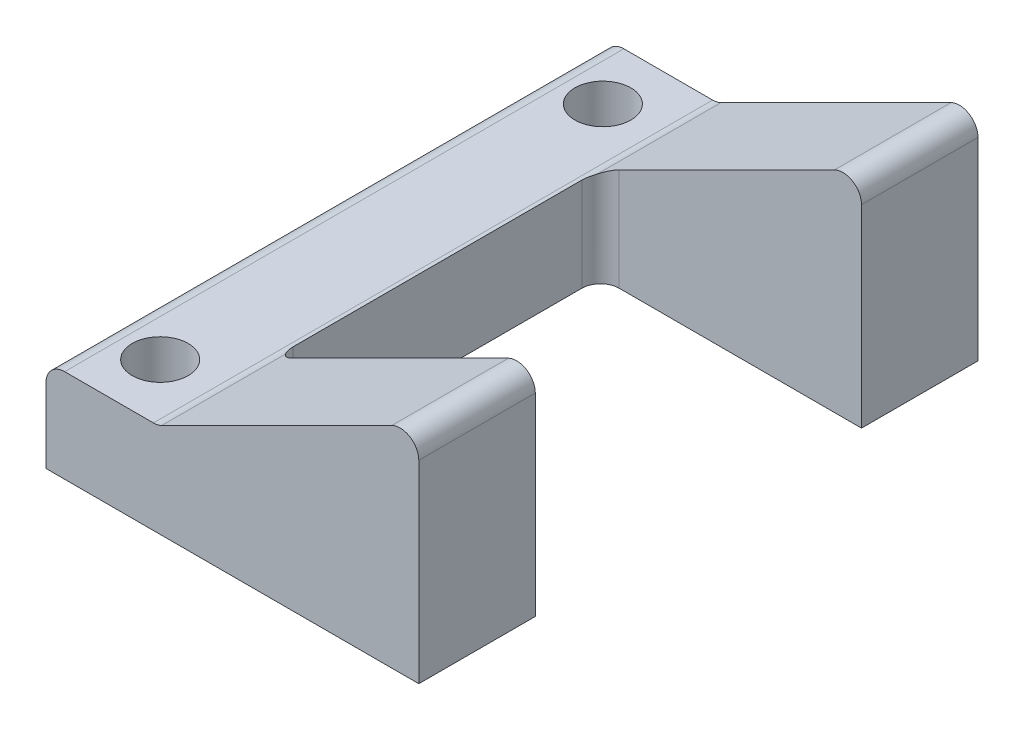
ISO-10303-21;
HEADER;
FILE_DESCRIPTION(('STEP AP214'),'2;1');
FILE_NAME('part.step','',(''),(''),'','','');
FILE_SCHEMA(('AUTOMOTIVE_DESIGN { 1 0 10303 214 1 1 1 1 }'));
ENDSEC;
DATA;
#1=APPLICATION_CONTEXT('core data for automotive mechanical design processes');
#2=APPLICATION_PROTOCOL_DEFINITION('international standard','automotive_design',2000,#1);
#3=PRODUCT_CONTEXT('',#1,'mechanical');
#4=PRODUCT('Part','Part','',(#3));
#5=PRODUCT_RELATED_PRODUCT_CATEGORY('part','',(#4));
#6=PRODUCT_DEFINITION_FORMATION('','',#4);
#7=PRODUCT_DEFINITION_CONTEXT('part definition',#1,'design');
#8=PRODUCT_DEFINITION('design','',#6,#7);
#9=PRODUCT_DEFINITION_SHAPE('','',#8);
#10=(LENGTH_UNIT() NAMED_UNIT(*) SI_UNIT(.MILLI.,.METRE.));
#11=(NAMED_UNIT(*) PLANE_ANGLE_UNIT() SI_UNIT($,.RADIAN.));
#12=(NAMED_UNIT(*) SI_UNIT($,.STERADIAN.) SOLID_ANGLE_UNIT());
#13=UNCERTAINTY_MEASURE_WITH_UNIT(LENGTH_MEASURE(1.E-05),#10,'distance_accuracy_value','');
#14=(GEOMETRIC_REPRESENTATION_CONTEXT(3) GLOBAL_UNCERTAINTY_ASSIGNED_CONTEXT((#13)) GLOBAL_UNIT_ASSIGNED_CONTEXT((#10,
#11,#12)) REPRESENTATION_CONTEXT('',''));
#15=CARTESIAN_POINT('',(0.,0.,0.));
#16=DIRECTION('',(0.,0.,1.));
#17=DIRECTION('',(1.,0.,0.));
#18=AXIS2_PLACEMENT_3D('',#15,#16,#17);
#19=CARTESIAN_POINT('',(20.,10.3819660112501,15.));
#20=DIRECTION('',(-1.,0.,0.));
#21=DIRECTION('',(0.,-1.,0.));
#22=AXIS2_PLACEMENT_3D('',#19,#20,#21);
#23=PLANE('',#22);
#24=DIRECTION('',(0.,0.,-1.));
#25=VECTOR('',#24,1.);
#26=CARTESIAN_POINT('',(20.,0.,15.));
#27=LINE('',#26,#25);
#28=CARTESIAN_POINT('',(20.,0.,15.));
#29=VERTEX_POINT('',#28);
#30=CARTESIAN_POINT('',(20.,0.,8.75));
#31=VERTEX_POINT('',#30);
#32=EDGE_CURVE('E179',#29,#31,#27,.T.);
#33=ORIENTED_EDGE('',*,*,#32,.T.);
#34=DIRECTION('',(0.,-1.,0.));
#35=VECTOR('',#34,1.);
#36=CARTESIAN_POINT('',(20.,30.,8.75));
#37=LINE('',#36,#35);
#38=CARTESIAN_POINT('',(20.,10.3819660112501,8.75));
#39=VERTEX_POINT('',#38);
#40=EDGE_CURVE('E285',#39,#31,#37,.T.);
#41=ORIENTED_EDGE('',*,*,#40,.F.);
#42=DIRECTION('',(0.,0.,-1.));
#43=VECTOR('',#42,1.);
#44=CARTESIAN_POINT('',(20.,10.3819660112501,15.));
#45=LINE('',#44,#43);
#46=CARTESIAN_POINT('',(20.,10.3819660112501,15.));
#47=VERTEX_POINT('',#46);
#48=EDGE_CURVE('E175',#47,#39,#45,.T.);
#49=ORIENTED_EDGE('',*,*,#48,.F.);
#50=DIRECTION('',(0.,1.,0.));
#51=VECTOR('',#50,1.);
#52=CARTESIAN_POINT('',(20.,10.3819660112501,15.));
#53=LINE('',#52,#51);
#54=EDGE_CURVE('E100',#29,#47,#53,.T.);
#55=ORIENTED_EDGE('',*,*,#54,.F.);
#56=EDGE_LOOP('',(#33,#41,#49,#55));
#57=FACE_BOUND('',#56,.T.);
#58=ADVANCED_FACE('F34',(#57),#23,.F.);
#59=CARTESIAN_POINT('',(19.,10.3819660112501,15.));
#60=DIRECTION('',(0.,0.,-1.));
#61=DIRECTION('',(-1.,0.,0.));
#62=AXIS2_PLACEMENT_3D('',#59,#60,#61);
#63=CYLINDRICAL_SURFACE('',#62,0.999999999999999);
#64=ORIENTED_EDGE('',*,*,#48,.T.);
#65=CARTESIAN_POINT('',(19.,10.3819660112501,8.75));
#66=DIRECTION('',(0.,0.,1.));
#67=DIRECTION('',(1.,0.,0.));
#68=AXIS2_PLACEMENT_3D('',#65,#66,#67);
#69=CIRCLE('',#68,0.999999999999999);
#70=CARTESIAN_POINT('',(18.5527864045,11.27639320225,8.75));
#71=VERTEX_POINT('',#70);
#72=EDGE_CURVE('E147',#39,#71,#69,.T.);
#73=ORIENTED_EDGE('',*,*,#72,.T.);
#74=DIRECTION('',(0.,0.,-1.));
#75=VECTOR('',#74,1.);
#76=CARTESIAN_POINT('',(18.5527864045,11.27639320225,15.));
#77=LINE('',#76,#75);
#78=CARTESIAN_POINT('',(18.5527864045,11.27639320225,15.));
#79=VERTEX_POINT('',#78);
#80=EDGE_CURVE('E171',#79,#71,#77,.T.);
#81=ORIENTED_EDGE('',*,*,#80,.F.);
#82=CARTESIAN_POINT('',(19.,10.3819660112501,15.));
#83=DIRECTION('',(0.,0.,1.));
#84=DIRECTION('',(-1.,0.,0.));
#85=AXIS2_PLACEMENT_3D('',#82,#83,#84);
#86=CIRCLE('',#85,0.999999999999999);
#87=EDGE_CURVE('E308',#47,#79,#86,.T.);
#88=ORIENTED_EDGE('',*,*,#87,.F.);
#89=EDGE_LOOP('',(#64,#73,#81,#88));
#90=FACE_BOUND('',#89,.T.);
#91=ADVANCED_FACE('F326',(#90),#63,.T.);
#92=CARTESIAN_POINT('',(6.21114561800017,5.10557280900008,15.));
#93=DIRECTION('',(0.447213595499958,-0.894427190999916,0.));
#94=DIRECTION('',(0.894427190999916,0.447213595499958,0.));
#95=AXIS2_PLACEMENT_3D('',#92,#93,#94);
#96=PLANE('',#95);
#97=DIRECTION('',(-0.894427190999916,-0.447213595499958,0.));
#98=VECTOR('',#97,1.);
#99=CARTESIAN_POINT('',(6.21114561800017,5.10557280900008,8.75));
#100=LINE('',#99,#98);
#101=CARTESIAN_POINT('',(7.00000000000001,5.50000000000001,8.75));
#102=VERTEX_POINT('',#101);
#103=EDGE_CURVE('E11',#71,#102,#100,.T.);
#104=ORIENTED_EDGE('',*,*,#103,.T.);
#105=CARTESIAN_POINT('',(7.,5.5,7.75));
#106=DIRECTION('',(0.447213595499958,-0.894427190999916,0.));
#107=DIRECTION('',(-0.894427190999916,-0.447213595499958,0.));
#108=AXIS2_PLACEMENT_3D('',#105,#106,#107);
#109=ELLIPSE('',#108,1.11803398874989,1.);
#110=CARTESIAN_POINT('',(6.21114561800017,5.10557280900008,8.36458015262426));
#111=VERTEX_POINT('',#110);
#112=EDGE_CURVE('E189',#102,#111,#109,.T.);
#113=ORIENTED_EDGE('',*,*,#112,.T.);
#114=DIRECTION('',(0.,0.,-1.));
#115=VECTOR('',#114,1.);
#116=CARTESIAN_POINT('',(6.21114561800017,5.10557280900008,15.));
#117=LINE('',#116,#115);
#118=CARTESIAN_POINT('',(6.21114561800017,5.10557280900008,15.));
#119=VERTEX_POINT('',#118);
#120=EDGE_CURVE('E167',#119,#111,#117,.T.);
#121=ORIENTED_EDGE('',*,*,#120,.F.);
#122=DIRECTION('',(-0.894427190999916,-0.447213595499958,0.));
#123=VECTOR('',#122,1.);
#124=CARTESIAN_POINT('',(6.21114561800017,5.10557280900008,15.));
#125=LINE('',#124,#123);
#126=EDGE_CURVE('E310',#79,#119,#125,.T.);
#127=ORIENTED_EDGE('',*,*,#126,.F.);
#128=ORIENTED_EDGE('',*,*,#80,.T.);
#129=EDGE_LOOP('',(#104,#113,#121,#127,#128));
#130=FACE_BOUND('',#129,.T.);
#131=ADVANCED_FACE('F316',(#130),#96,.F.);
#132=CARTESIAN_POINT('',(20.,0.,15.));
#133=DIRECTION('',(0.,1.,0.));
#134=DIRECTION('',(0.,0.,1.));
#135=AXIS2_PLACEMENT_3D('',#132,#133,#134);
#136=PLANE('',#135);
#137=CARTESIAN_POINT('',(3.,0.,11.875));
#138=DIRECTION('',(0.,-1.,0.));
#139=DIRECTION('',(1.,0.,0.));
#140=AXIS2_PLACEMENT_3D('',#137,#138,#139);
#141=CIRCLE('',#140,1.5);
#142=CARTESIAN_POINT('',(4.5,0.,11.875));
#143=VERTEX_POINT('',#142);
#144=EDGE_CURVE('E293',#143,#143,#141,.T.);
#145=ORIENTED_EDGE('',*,*,#144,.F.);
#146=EDGE_LOOP('',(#145));
#147=FACE_BOUND('',#146,.T.);
#148=CARTESIAN_POINT('',(3.,0.,-11.875));
#149=DIRECTION('',(0.,-1.,0.));
#150=DIRECTION('',(-1.,0.,0.));
#151=AXIS2_PLACEMENT_3D('',#148,#149,#150);
#152=CIRCLE('',#151,1.5);
#153=CARTESIAN_POINT('',(1.5,0.,-11.875));
#154=VERTEX_POINT('',#153);
#155=EDGE_CURVE('E297',#154,#154,#152,.T.);
#156=ORIENTED_EDGE('',*,*,#155,.F.);
#157=EDGE_LOOP('',(#156));
#158=FACE_BOUND('',#157,.T.);
#159=CARTESIAN_POINT('',(7.,0.,7.75));
#160=DIRECTION('',(0.,-1.,0.));
#161=DIRECTION('',(1.,0.,0.));
#162=AXIS2_PLACEMENT_3D('',#159,#160,#161);
#163=CIRCLE('',#162,1.);
#164=CARTESIAN_POINT('',(7.00000000000001,0.,8.75));
#165=VERTEX_POINT('',#164);
#166=CARTESIAN_POINT('',(6.,0.,7.74999999999999));
#167=VERTEX_POINT('',#166);
#168=EDGE_CURVE('E355',#165,#167,#163,.T.);
#169=ORIENTED_EDGE('',*,*,#168,.F.);
#170=DIRECTION('',(-1.,0.,0.));
#171=VECTOR('',#170,1.);
#172=CARTESIAN_POINT('',(20.,0.,8.75));
#173=LINE('',#172,#171);
#174=EDGE_CURVE('E352',#31,#165,#173,.T.);
#175=ORIENTED_EDGE('',*,*,#174,.F.);
#176=ORIENTED_EDGE('',*,*,#32,.F.);
#177=DIRECTION('',(1.,0.,0.));
#178=VECTOR('',#177,1.);
#179=CARTESIAN_POINT('',(20.,0.,15.));
#180=LINE('',#179,#178);
#181=CARTESIAN_POINT('',(0.,0.,15.));
#182=VERTEX_POINT('',#181);
#183=EDGE_CURVE('E162',#182,#29,#180,.T.);
#184=ORIENTED_EDGE('',*,*,#183,.F.);
#185=DIRECTION('',(0.,0.,-1.));
#186=VECTOR('',#185,1.);
#187=CARTESIAN_POINT('',(0.,0.,15.));
#188=LINE('',#187,#186);
#189=CARTESIAN_POINT('',(0.,0.,-15.));
#190=VERTEX_POINT('',#189);
#191=EDGE_CURVE('E139',#182,#190,#188,.T.);
#192=ORIENTED_EDGE('',*,*,#191,.T.);
#193=DIRECTION('',(1.,0.,0.));
#194=VECTOR('',#193,1.);
#195=CARTESIAN_POINT('',(20.,0.,-15.));
#196=LINE('',#195,#194);
#197=CARTESIAN_POINT('',(20.,0.,-15.));
#198=VERTEX_POINT('',#197);
#199=EDGE_CURVE('E143',#190,#198,#196,.T.);
#200=ORIENTED_EDGE('',*,*,#199,.T.);
#201=CARTESIAN_POINT('',(20.,0.,-8.75));
#202=VERTEX_POINT('',#201);
#203=EDGE_CURVE('E178',#202,#198,#27,.T.);
#204=ORIENTED_EDGE('',*,*,#203,.F.);
#205=DIRECTION('',(1.,0.,0.));
#206=VECTOR('',#205,1.);
#207=CARTESIAN_POINT('',(20.,0.,-8.75));
#208=LINE('',#207,#206);
#209=CARTESIAN_POINT('',(7.00000000000001,0.,-8.75));
#210=VERTEX_POINT('',#209);
#211=EDGE_CURVE('E349',#210,#202,#208,.T.);
#212=ORIENTED_EDGE('',*,*,#211,.F.);
#213=CARTESIAN_POINT('',(7.00000000000001,0.,-7.75));
#214=DIRECTION('',(0.,-1.,0.));
#215=DIRECTION('',(-1.,0.,0.));
#216=AXIS2_PLACEMENT_3D('',#213,#214,#215);
#217=CIRCLE('',#216,1.);
#218=CARTESIAN_POINT('',(6.00000000000001,0.,-7.75));
#219=VERTEX_POINT('',#218);
#220=EDGE_CURVE('E296',#219,#210,#217,.T.);
#221=ORIENTED_EDGE('',*,*,#220,.F.);
#222=DIRECTION('',(0.,0.,-1.));
#223=VECTOR('',#222,1.);
#224=CARTESIAN_POINT('',(6.,0.,7.74999999999999));
#225=LINE('',#224,#223);
#226=EDGE_CURVE('E275',#167,#219,#225,.T.);
#227=ORIENTED_EDGE('',*,*,#226,.F.);
#228=EDGE_LOOP('',(#169,#175,#176,#184,#192,#200,#204,#212,#221,#227));
#229=FACE_BOUND('',#228,.T.);
#230=ADVANCED_FACE('F36',(#147,#158,#229),#136,.F.);
#231=CARTESIAN_POINT('',(20.,10.3819660112501,-8.75));
#232=VERTEX_POINT('',#231);
#233=CARTESIAN_POINT('',(20.,10.3819660112501,-15.));
#234=VERTEX_POINT('',#233);
#235=EDGE_CURVE('E174',#232,#234,#45,.T.);
#236=ORIENTED_EDGE('',*,*,#235,.F.);
#237=DIRECTION('',(0.,-1.,0.));
#238=VECTOR('',#237,1.);
#239=CARTESIAN_POINT('',(20.,30.,-8.75));
#240=LINE('',#239,#238);
#241=EDGE_CURVE('E288',#232,#202,#240,.T.);
#242=ORIENTED_EDGE('',*,*,#241,.T.);
#243=ORIENTED_EDGE('',*,*,#203,.T.);
#244=DIRECTION('',(0.,1.,0.));
#245=VECTOR('',#244,1.);
#246=CARTESIAN_POINT('',(20.,10.3819660112501,-15.));
#247=LINE('',#246,#245);
#248=EDGE_CURVE('E146',#198,#234,#247,.T.);
#249=ORIENTED_EDGE('',*,*,#248,.T.);
#250=EDGE_LOOP('',(#236,#242,#243,#249));
#251=FACE_BOUND('',#250,.T.);
#252=ADVANCED_FACE('F358',(#251),#23,.F.);
#253=CARTESIAN_POINT('',(18.5527864045,11.27639320225,-8.75));
#254=VERTEX_POINT('',#253);
#255=CARTESIAN_POINT('',(18.5527864045,11.27639320225,-15.));
#256=VERTEX_POINT('',#255);
#257=EDGE_CURVE('E170',#254,#256,#77,.T.);
#258=ORIENTED_EDGE('',*,*,#257,.F.);
#259=CARTESIAN_POINT('',(19.,10.3819660112501,-8.75));
#260=DIRECTION('',(0.,0.,-1.));
#261=DIRECTION('',(-1.,0.,0.));
#262=AXIS2_PLACEMENT_3D('',#259,#260,#261);
#263=CIRCLE('',#262,0.999999999999999);
#264=EDGE_CURVE('E251',#254,#232,#263,.T.);
#265=ORIENTED_EDGE('',*,*,#264,.T.);
#266=ORIENTED_EDGE('',*,*,#235,.T.);
#267=CARTESIAN_POINT('',(19.,10.3819660112501,-15.));
#268=DIRECTION('',(0.,0.,1.));
#269=DIRECTION('',(-1.,0.,0.));
#270=AXIS2_PLACEMENT_3D('',#267,#268,#269);
#271=CIRCLE('',#270,0.999999999999999);
#272=EDGE_CURVE('E150',#234,#256,#271,.T.);
#273=ORIENTED_EDGE('',*,*,#272,.T.);
#274=EDGE_LOOP('',(#258,#265,#266,#273));
#275=FACE_BOUND('',#274,.T.);
#276=ADVANCED_FACE('F250',(#275),#63,.T.);
#277=CARTESIAN_POINT('',(6.21114561800017,5.10557280900008,-8.36458015262426));
#278=VERTEX_POINT('',#277);
#279=CARTESIAN_POINT('',(6.21114561800017,5.10557280900008,-15.));
#280=VERTEX_POINT('',#279);
#281=EDGE_CURVE('E166',#278,#280,#117,.T.);
#282=ORIENTED_EDGE('',*,*,#281,.F.);
#283=CARTESIAN_POINT('',(7.00000000000001,5.50000000000001,-7.75));
#284=DIRECTION('',(0.447213595499958,-0.894427190999916,0.));
#285=DIRECTION('',(-0.894427190999916,-0.447213595499958,0.));
#286=AXIS2_PLACEMENT_3D('',#283,#284,#285);
#287=ELLIPSE('',#286,1.11803398874989,1.);
#288=CARTESIAN_POINT('',(7.00000000000001,5.50000000000001,-8.75));
#289=VERTEX_POINT('',#288);
#290=EDGE_CURVE('E241',#278,#289,#287,.T.);
#291=ORIENTED_EDGE('',*,*,#290,.T.);
#292=DIRECTION('',(0.894427190999916,0.447213595499958,0.));
#293=VECTOR('',#292,1.);
#294=CARTESIAN_POINT('',(6.21114561800017,5.10557280900008,-8.75));
#295=LINE('',#294,#293);
#296=EDGE_CURVE('E42',#289,#254,#295,.T.);
#297=ORIENTED_EDGE('',*,*,#296,.T.);
#298=ORIENTED_EDGE('',*,*,#257,.T.);
#299=DIRECTION('',(-0.894427190999916,-0.447213595499958,0.));
#300=VECTOR('',#299,1.);
#301=CARTESIAN_POINT('',(6.21114561800017,5.10557280900008,-15.));
#302=LINE('',#301,#300);
#303=EDGE_CURVE('E153',#256,#280,#302,.T.);
#304=ORIENTED_EDGE('',*,*,#303,.T.);
#305=EDGE_LOOP('',(#282,#291,#297,#298,#304));
#306=FACE_BOUND('',#305,.T.);
#307=ADVANCED_FACE('F238',(#306),#96,.F.);
#308=CARTESIAN_POINT('',(5.76393202250021,6.,15.));
#309=DIRECTION('',(0.,0.,-1.));
#310=DIRECTION('',(-1.,0.,0.));
#311=AXIS2_PLACEMENT_3D('',#308,#309,#310);
#312=CYLINDRICAL_SURFACE('',#311,1.);
#313=DIRECTION('',(0.,0.,-1.));
#314=VECTOR('',#313,1.);
#315=CARTESIAN_POINT('',(6.,5.02826345648671,15.));
#316=LINE('',#315,#314);
#317=CARTESIAN_POINT('',(6.,5.02826345648667,7.75000000000001));
#318=VERTEX_POINT('',#317);
#319=CARTESIAN_POINT('',(6.00000000000001,5.02826345648671,-7.75));
#320=VERTEX_POINT('',#319);
#321=EDGE_CURVE('E198',#318,#320,#316,.T.);
#322=ORIENTED_EDGE('',*,*,#321,.T.);
#323=CARTESIAN_POINT('',(6.00000000000001,5.02826345648671,-7.75));
#324=CARTESIAN_POINT('',(6.00000108503513,5.02826991902766,-7.77696505629862));
#325=CARTESIAN_POINT('',(6.00109182975969,5.02852793022184,-7.8039138979491));
#326=CARTESIAN_POINT('',(6.00544245105983,5.02959802513672,-7.85762379533837));
#327=CARTESIAN_POINT('',(6.00870226155977,5.03041009197938,-7.88438485677237));
#328=CARTESIAN_POINT('',(6.02145621340975,5.03368607056726,-7.96253870131545));
#329=CARTESIAN_POINT('',(6.03393016862076,5.03698507158128,-8.01346016659564));
#330=CARTESIAN_POINT('',(6.05915548304621,5.04452844853154,-8.09004786055815));
#331=CARTESIAN_POINT('',(6.06924222634334,5.04767466086833,-8.11674261284329));
#332=CARTESIAN_POINT('',(6.0915906577913,5.05512992214839,-8.16904636658812));
#333=CARTESIAN_POINT('',(6.10385212636265,5.05943885371616,-8.19465547734061));
#334=CARTESIAN_POINT('',(6.13082435521559,5.06962116623138,-8.24536242237636));
#335=CARTESIAN_POINT('',(6.14560321410852,5.07554196995178,-8.27041465148558));
#336=CARTESIAN_POINT('',(6.17703826409949,5.08915728444144,-8.31883665333037));
#337=CARTESIAN_POINT('',(6.19369640019005,5.09685364161954,-8.34220464118096));
#338=CARTESIAN_POINT('',(6.21114561800017,5.10557280900006,-8.36458015262426));
#339=B_SPLINE_CURVE_WITH_KNOTS('',3,(#323,#324,#325,#326,#327,#328,#329,#330,#331,#332,#333,
#334,#335,#336,#337,#338),.UNSPECIFIED.,.F.,.F.,(4,2,2,2,2,2,2,4),(0.,0.0808392623134594,
0.161676062155883,0.318433486687678,0.404462158794646,0.490482149627477,0.579373660857239,
0.668358030943261),.UNSPECIFIED.);
#340=EDGE_CURVE('E225',#320,#278,#339,.T.);
#341=ORIENTED_EDGE('',*,*,#340,.T.);
#342=ORIENTED_EDGE('',*,*,#281,.T.);
#343=CARTESIAN_POINT('',(5.76393202250021,6.,-15.));
#344=DIRECTION('',(0.,0.,-1.));
#345=DIRECTION('',(1.,0.,0.));
#346=AXIS2_PLACEMENT_3D('',#343,#344,#345);
#347=CIRCLE('',#346,1.);
#348=CARTESIAN_POINT('',(5.76393202250021,5.,-15.));
#349=VERTEX_POINT('',#348);
#350=EDGE_CURVE('E156',#280,#349,#347,.T.);
#351=ORIENTED_EDGE('',*,*,#350,.T.);
#352=DIRECTION('',(0.,0.,-1.));
#353=VECTOR('',#352,1.);
#354=CARTESIAN_POINT('',(5.76393202250021,5.,15.));
#355=LINE('',#354,#353);
#356=CARTESIAN_POINT('',(5.76393202250021,5.,15.));
#357=VERTEX_POINT('',#356);
#358=EDGE_CURVE('E134',#357,#349,#355,.T.);
#359=ORIENTED_EDGE('',*,*,#358,.F.);
#360=CARTESIAN_POINT('',(5.76393202250021,6.,15.));
#361=DIRECTION('',(0.,0.,-1.));
#362=DIRECTION('',(1.,0.,0.));
#363=AXIS2_PLACEMENT_3D('',#360,#361,#362);
#364=CIRCLE('',#363,1.);
#365=EDGE_CURVE('E122',#119,#357,#364,.T.);
#366=ORIENTED_EDGE('',*,*,#365,.F.);
#367=ORIENTED_EDGE('',*,*,#120,.T.);
#368=CARTESIAN_POINT('',(6.21114561800017,5.10557280900008,8.36458015262426));
#369=CARTESIAN_POINT('',(6.19601330222527,5.09800845693931,8.34516443705304));
#370=CARTESIAN_POINT('',(6.18147328205301,5.09121603514318,8.32501343442704));
#371=CARTESIAN_POINT('',(6.15377674796541,5.0789949403185,8.28341226906747));
#372=CARTESIAN_POINT('',(6.14061919378394,5.07356523754805,8.26196310259966));
#373=CARTESIAN_POINT('',(6.10359252514132,5.05907733753005,8.19607065704866));
#374=CARTESIAN_POINT('',(6.08203472914427,5.05175788754173,8.14991098962576));
#375=CARTESIAN_POINT('',(6.04617062958198,5.04047108284208,8.05463482268548));
#376=CARTESIAN_POINT('',(6.031849288148,5.03649676516205,8.00552469420499));
#377=CARTESIAN_POINT('',(6.01084906834874,5.03090249191278,7.90553524856504));
#378=CARTESIAN_POINT('',(6.00417548191701,5.02928416638461,7.85465473142315));
#379=CARTESIAN_POINT('',(5.99855792319773,5.02790876896408,7.74990451012902));
#380=CARTESIAN_POINT('',(6.00001423095266,5.02824811057326,7.69601183270239));
#381=CARTESIAN_POINT('',(6.01155578463148,5.0311260799928,7.58917150923623));
#382=CARTESIAN_POINT('',(6.02164751516593,5.03366636057543,7.53622460391727));
#383=CARTESIAN_POINT('',(6.05030902489284,5.04176526720746,7.43212796237637));
#384=CARTESIAN_POINT('',(6.06899301128524,5.0473647505649,7.38101276598894));
#385=CARTESIAN_POINT('',(6.1140547189294,5.06299655945606,7.28311370511049));
#386=CARTESIAN_POINT('',(6.14040865557891,5.07301522983074,7.23631703097884));
#387=CARTESIAN_POINT('',(6.17638888055598,5.08899448460659,7.18271923694214));
#388=CARTESIAN_POINT('',(6.18314768702125,5.09208139668792,7.17303229022799));
#389=CARTESIAN_POINT('',(6.19694290835104,5.09857897010933,7.15398283237796));
#390=CARTESIAN_POINT('',(6.20397908928241,5.10198936190677,7.14462005984905));
#391=CARTESIAN_POINT('',(6.21114561800001,5.10557280899941,7.13541984737543));
#392=B_SPLINE_CURVE_WITH_KNOTS('',3,(#368,#369,#370,#371,#372,#373,#374,#375,#376,#377,#378,
#379,#380,#381,#382,#383,#384,#385,#386,#387,#388,#389,#390,#391),.UNSPECIFIED.,.F.,.F.,(4,2,2,
2,2,2,2,2,2,2,2,4),(0.,0.0771924162682057,0.154326325075832,0.307923476709058,0.461200116116118,
0.614582752765988,0.77558181497473,0.936701882647221,1.10002835327527,1.26285364712873,
1.29947195057452,1.33606000511459),.UNSPECIFIED.);
#393=EDGE_CURVE('E181',#111,#318,#392,.T.);
#394=ORIENTED_EDGE('',*,*,#393,.T.);
#395=EDGE_LOOP('',(#322,#341,#342,#351,#359,#366,#367,#394));
#396=FACE_BOUND('',#395,.T.);
#397=ADVANCED_FACE('F200',(#396),#312,.F.);
#398=CARTESIAN_POINT('',(1.00000000000001,5.,15.));
#399=DIRECTION('',(0.,-1.,0.));
#400=DIRECTION('',(1.,0.,0.));
#401=AXIS2_PLACEMENT_3D('',#398,#399,#400);
#402=PLANE('',#401);
#403=CARTESIAN_POINT('',(3.,5.,11.875));
#404=DIRECTION('',(0.,-1.,0.));
#405=DIRECTION('',(1.,0.,0.));
#406=AXIS2_PLACEMENT_3D('',#403,#404,#405);
#407=CIRCLE('',#406,1.5);
#408=CARTESIAN_POINT('',(4.5,5.,11.875));
#409=VERTEX_POINT('',#408);
#410=EDGE_CURVE('E185',#409,#409,#407,.T.);
#411=ORIENTED_EDGE('',*,*,#410,.T.);
#412=EDGE_LOOP('',(#411));
#413=FACE_BOUND('',#412,.T.);
#414=CARTESIAN_POINT('',(3.,5.,-11.875));
#415=DIRECTION('',(0.,-1.,0.));
#416=DIRECTION('',(1.,0.,0.));
#417=AXIS2_PLACEMENT_3D('',#414,#415,#416);
#418=CIRCLE('',#417,1.5);
#419=CARTESIAN_POINT('',(4.5,5.,-11.875));
#420=VERTEX_POINT('',#419);
#421=EDGE_CURVE('E182',#420,#420,#418,.T.);
#422=ORIENTED_EDGE('',*,*,#421,.T.);
#423=EDGE_LOOP('',(#422));
#424=FACE_BOUND('',#423,.T.);
#425=DIRECTION('',(-1.,0.,0.));
#426=VECTOR('',#425,1.);
#427=CARTESIAN_POINT('',(1.00000000000001,5.,-15.));
#428=LINE('',#427,#426);
#429=CARTESIAN_POINT('',(1.00000000000001,5.,-15.));
#430=VERTEX_POINT('',#429);
#431=EDGE_CURVE('E131',#349,#430,#428,.T.);
#432=ORIENTED_EDGE('',*,*,#431,.T.);
#433=DIRECTION('',(0.,0.,-1.));
#434=VECTOR('',#433,1.);
#435=CARTESIAN_POINT('',(1.00000000000001,5.,15.));
#436=LINE('',#435,#434);
#437=CARTESIAN_POINT('',(1.00000000000001,5.,15.));
#438=VERTEX_POINT('',#437);
#439=EDGE_CURVE('E128',#438,#430,#436,.T.);
#440=ORIENTED_EDGE('',*,*,#439,.F.);
#441=DIRECTION('',(-1.,0.,0.));
#442=VECTOR('',#441,1.);
#443=CARTESIAN_POINT('',(1.00000000000001,5.,15.));
#444=LINE('',#443,#442);
#445=EDGE_CURVE('E115',#357,#438,#444,.T.);
#446=ORIENTED_EDGE('',*,*,#445,.F.);
#447=ORIENTED_EDGE('',*,*,#358,.T.);
#448=EDGE_LOOP('',(#432,#440,#446,#447));
#449=FACE_BOUND('',#448,.T.);
#450=ADVANCED_FACE('F129',(#413,#424,#449),#402,.F.);
#451=CARTESIAN_POINT('',(1.,4.,15.));
#452=DIRECTION('',(0.,0.,-1.));
#453=DIRECTION('',(-1.,0.,0.));
#454=AXIS2_PLACEMENT_3D('',#451,#452,#453);
#455=CYLINDRICAL_SURFACE('',#454,1.);
#456=CARTESIAN_POINT('',(1.,4.,-15.));
#457=DIRECTION('',(0.,0.,1.));
#458=DIRECTION('',(-1.,0.,0.));
#459=AXIS2_PLACEMENT_3D('',#456,#457,#458);
#460=CIRCLE('',#459,1.);
#461=CARTESIAN_POINT('',(0.,3.99999999999999,-15.));
#462=VERTEX_POINT('',#461);
#463=EDGE_CURVE('E159',#430,#462,#460,.T.);
#464=ORIENTED_EDGE('',*,*,#463,.T.);
#465=DIRECTION('',(0.,0.,-1.));
#466=VECTOR('',#465,1.);
#467=CARTESIAN_POINT('',(0.,3.99999999999999,15.));
#468=LINE('',#467,#466);
#469=CARTESIAN_POINT('',(0.,3.99999999999999,15.));
#470=VERTEX_POINT('',#469);
#471=EDGE_CURVE('E135',#470,#462,#468,.T.);
#472=ORIENTED_EDGE('',*,*,#471,.F.);
#473=CARTESIAN_POINT('',(1.,4.,15.));
#474=DIRECTION('',(0.,0.,1.));
#475=DIRECTION('',(-1.,0.,0.));
#476=AXIS2_PLACEMENT_3D('',#473,#474,#475);
#477=CIRCLE('',#476,1.);
#478=EDGE_CURVE('E119',#438,#470,#477,.T.);
#479=ORIENTED_EDGE('',*,*,#478,.F.);
#480=ORIENTED_EDGE('',*,*,#439,.T.);
#481=EDGE_LOOP('',(#464,#472,#479,#480));
#482=FACE_BOUND('',#481,.T.);
#483=ADVANCED_FACE('F137',(#482),#455,.T.);
#484=CARTESIAN_POINT('',(0.,0.,15.));
#485=DIRECTION('',(1.,0.,0.));
#486=DIRECTION('',(0.,0.,-1.));
#487=AXIS2_PLACEMENT_3D('',#484,#485,#486);
#488=PLANE('',#487);
#489=DIRECTION('',(0.,-1.,0.));
#490=VECTOR('',#489,1.);
#491=CARTESIAN_POINT('',(0.,0.,-15.));
#492=LINE('',#491,#490);
#493=EDGE_CURVE('E91',#462,#190,#492,.T.);
#494=ORIENTED_EDGE('',*,*,#493,.T.);
#495=ORIENTED_EDGE('',*,*,#191,.F.);
#496=DIRECTION('',(0.,-1.,0.));
#497=VECTOR('',#496,1.);
#498=CARTESIAN_POINT('',(0.,0.,15.));
#499=LINE('',#498,#497);
#500=EDGE_CURVE('E58',#470,#182,#499,.T.);
#501=ORIENTED_EDGE('',*,*,#500,.F.);
#502=ORIENTED_EDGE('',*,*,#471,.T.);
#503=EDGE_LOOP('',(#494,#495,#501,#502));
#504=FACE_BOUND('',#503,.T.);
#505=ADVANCED_FACE('F318',(#504),#488,.F.);
#506=CARTESIAN_POINT('',(1.,4.,15.));
#507=DIRECTION('',(0.,0.,-1.));
#508=DIRECTION('',(-1.,0.,0.));
#509=AXIS2_PLACEMENT_3D('',#506,#507,#508);
#510=PLANE('',#509);
#511=ORIENTED_EDGE('',*,*,#183,.T.);
#512=ORIENTED_EDGE('',*,*,#54,.T.);
#513=ORIENTED_EDGE('',*,*,#87,.T.);
#514=ORIENTED_EDGE('',*,*,#126,.T.);
#515=ORIENTED_EDGE('',*,*,#365,.T.);
#516=ORIENTED_EDGE('',*,*,#445,.T.);
#517=ORIENTED_EDGE('',*,*,#478,.T.);
#518=ORIENTED_EDGE('',*,*,#500,.T.);
#519=EDGE_LOOP('',(#511,#512,#513,#514,#515,#516,#517,#518));
#520=FACE_BOUND('',#519,.T.);
#521=ADVANCED_FACE('F117',(#520),#510,.F.);
#522=CARTESIAN_POINT('',(1.,4.,-15.));
#523=DIRECTION('',(0.,0.,-1.));
#524=DIRECTION('',(-1.,0.,0.));
#525=AXIS2_PLACEMENT_3D('',#522,#523,#524);
#526=PLANE('',#525);
#527=ORIENTED_EDGE('',*,*,#199,.F.);
#528=ORIENTED_EDGE('',*,*,#493,.F.);
#529=ORIENTED_EDGE('',*,*,#463,.F.);
#530=ORIENTED_EDGE('',*,*,#431,.F.);
#531=ORIENTED_EDGE('',*,*,#350,.F.);
#532=ORIENTED_EDGE('',*,*,#303,.F.);
#533=ORIENTED_EDGE('',*,*,#272,.F.);
#534=ORIENTED_EDGE('',*,*,#248,.F.);
#535=EDGE_LOOP('',(#527,#528,#529,#530,#531,#532,#533,#534));
#536=FACE_BOUND('',#535,.T.);
#537=ADVANCED_FACE('F259',(#536),#526,.T.);
#538=CARTESIAN_POINT('',(3.,30.,-11.875));
#539=DIRECTION('',(0.,-1.,0.));
#540=DIRECTION('',(1.,0.,0.));
#541=AXIS2_PLACEMENT_3D('',#538,#539,#540);
#542=CYLINDRICAL_SURFACE('',#541,1.5);
#543=ORIENTED_EDGE('',*,*,#155,.T.);
#544=EDGE_LOOP('',(#543));
#545=FACE_BOUND('',#544,.T.);
#546=ORIENTED_EDGE('',*,*,#421,.F.);
#547=EDGE_LOOP('',(#546));
#548=FACE_BOUND('',#547,.T.);
#549=ADVANCED_FACE('F391',(#545,#548),#542,.F.);
#550=CARTESIAN_POINT('',(3.,30.,11.875));
#551=DIRECTION('',(0.,-1.,0.));
#552=DIRECTION('',(1.,0.,0.));
#553=AXIS2_PLACEMENT_3D('',#550,#551,#552);
#554=CYLINDRICAL_SURFACE('',#553,1.5);
#555=ORIENTED_EDGE('',*,*,#144,.T.);
#556=EDGE_LOOP('',(#555));
#557=FACE_BOUND('',#556,.T.);
#558=ORIENTED_EDGE('',*,*,#410,.F.);
#559=EDGE_LOOP('',(#558));
#560=FACE_BOUND('',#559,.T.);
#561=ADVANCED_FACE('F214',(#557,#560),#554,.F.);
#562=CARTESIAN_POINT('',(20.,30.,8.75));
#563=DIRECTION('',(0.,0.,1.));
#564=DIRECTION('',(1.,0.,0.));
#565=AXIS2_PLACEMENT_3D('',#562,#563,#564);
#566=PLANE('',#565);
#567=ORIENTED_EDGE('',*,*,#40,.T.);
#568=ORIENTED_EDGE('',*,*,#174,.T.);
#569=DIRECTION('',(0.,-1.,0.));
#570=VECTOR('',#569,1.);
#571=CARTESIAN_POINT('',(7.00000000000001,30.,8.75));
#572=LINE('',#571,#570);
#573=EDGE_CURVE('E278',#102,#165,#572,.T.);
#574=ORIENTED_EDGE('',*,*,#573,.F.);
#575=ORIENTED_EDGE('',*,*,#103,.F.);
#576=ORIENTED_EDGE('',*,*,#72,.F.);
#577=EDGE_LOOP('',(#567,#568,#574,#575,#576));
#578=FACE_BOUND('',#577,.T.);
#579=ADVANCED_FACE('F210',(#578),#566,.F.);
#580=CARTESIAN_POINT('',(20.,30.,-8.75));
#581=DIRECTION('',(0.,0.,-1.));
#582=DIRECTION('',(-1.,0.,0.));
#583=AXIS2_PLACEMENT_3D('',#580,#581,#582);
#584=PLANE('',#583);
#585=ORIENTED_EDGE('',*,*,#296,.F.);
#586=DIRECTION('',(0.,-1.,0.));
#587=VECTOR('',#586,1.);
#588=CARTESIAN_POINT('',(7.00000000000001,30.,-8.75));
#589=LINE('',#588,#587);
#590=EDGE_CURVE('E291',#289,#210,#589,.T.);
#591=ORIENTED_EDGE('',*,*,#590,.T.);
#592=ORIENTED_EDGE('',*,*,#211,.T.);
#593=ORIENTED_EDGE('',*,*,#241,.F.);
#594=ORIENTED_EDGE('',*,*,#264,.F.);
#595=EDGE_LOOP('',(#585,#591,#592,#593,#594));
#596=FACE_BOUND('',#595,.T.);
#597=ADVANCED_FACE('F213',(#596),#584,.F.);
#598=CARTESIAN_POINT('',(7.,30.,-7.75));
#599=DIRECTION('',(0.,-1.,0.));
#600=DIRECTION('',(1.,0.,0.));
#601=AXIS2_PLACEMENT_3D('',#598,#599,#600);
#602=CYLINDRICAL_SURFACE('',#601,1.);
#603=ORIENTED_EDGE('',*,*,#340,.F.);
#604=DIRECTION('',(0.,-1.,0.));
#605=VECTOR('',#604,1.);
#606=CARTESIAN_POINT('',(6.,30.,-7.75));
#607=LINE('',#606,#605);
#608=EDGE_CURVE('E186',#320,#219,#607,.T.);
#609=ORIENTED_EDGE('',*,*,#608,.T.);
#610=ORIENTED_EDGE('',*,*,#220,.T.);
#611=ORIENTED_EDGE('',*,*,#590,.F.);
#612=ORIENTED_EDGE('',*,*,#290,.F.);
#613=EDGE_LOOP('',(#603,#609,#610,#611,#612));
#614=FACE_BOUND('',#613,.T.);
#615=ADVANCED_FACE('F218',(#614),#602,.F.);
#616=CARTESIAN_POINT('',(6.,30.,7.74999999999999));
#617=DIRECTION('',(-1.,0.,0.));
#618=DIRECTION('',(0.,0.,1.));
#619=AXIS2_PLACEMENT_3D('',#616,#617,#618);
#620=PLANE('',#619);
#621=DIRECTION('',(0.,-1.,0.));
#622=VECTOR('',#621,1.);
#623=CARTESIAN_POINT('',(6.,30.,7.74999999999999));
#624=LINE('',#623,#622);
#625=EDGE_CURVE('E49',#318,#167,#624,.T.);
#626=ORIENTED_EDGE('',*,*,#625,.T.);
#627=ORIENTED_EDGE('',*,*,#226,.T.);
#628=ORIENTED_EDGE('',*,*,#608,.F.);
#629=ORIENTED_EDGE('',*,*,#321,.F.);
#630=EDGE_LOOP('',(#626,#627,#628,#629));
#631=FACE_BOUND('',#630,.T.);
#632=ADVANCED_FACE('F209',(#631),#620,.F.);
#633=CARTESIAN_POINT('',(7.,30.,7.75));
#634=DIRECTION('',(0.,-1.,0.));
#635=DIRECTION('',(1.,0.,0.));
#636=AXIS2_PLACEMENT_3D('',#633,#634,#635);
#637=CYLINDRICAL_SURFACE('',#636,1.);
#638=ORIENTED_EDGE('',*,*,#573,.T.);
#639=ORIENTED_EDGE('',*,*,#168,.T.);
#640=ORIENTED_EDGE('',*,*,#625,.F.);
#641=ORIENTED_EDGE('',*,*,#393,.F.);
#642=ORIENTED_EDGE('',*,*,#112,.F.);
#643=EDGE_LOOP('',(#638,#639,#640,#641,#642));
#644=FACE_BOUND('',#643,.T.);
#645=ADVANCED_FACE('F204',(#644),#637,.F.);
#646=CLOSED_SHELL('',(#58,#91,#131,#230,#252,#276,#307,#397,#450,#483,#505,#521,#537,#549,#561,
#579,#597,#615,#632,#645));
#647=MANIFOLD_SOLID_BREP('B2',#646);
#648=ADVANCED_BREP_SHAPE_REPRESENTATION('',(#18,#647),#14);
#649=SHAPE_DEFINITION_REPRESENTATION(#9,#648);
ENDSEC;
END-ISO-10303-21;
